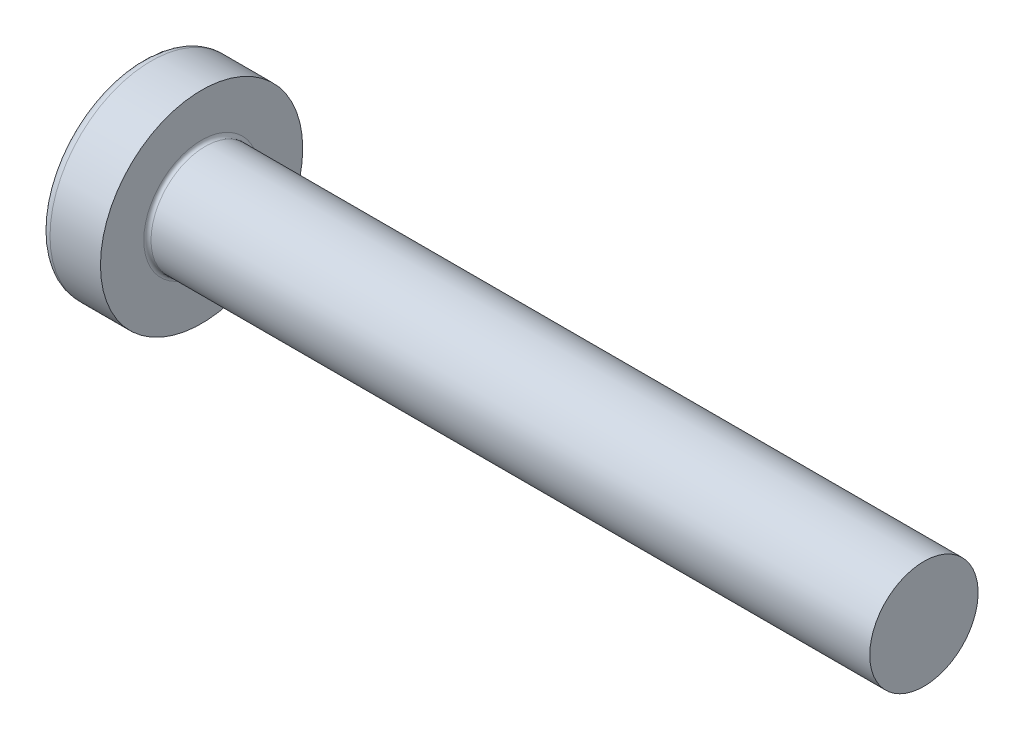
ISO-10303-21;
HEADER;
FILE_DESCRIPTION(('STEP AP214'),'2;1');
FILE_NAME('part.step','',(''),(''),'','','');
FILE_SCHEMA(('AUTOMOTIVE_DESIGN { 1 0 10303 214 1 1 1 1 }'));
ENDSEC;
DATA;
#1=APPLICATION_CONTEXT('core data for automotive mechanical design processes');
#2=APPLICATION_PROTOCOL_DEFINITION('international standard','automotive_design',2000,#1);
#3=PRODUCT_CONTEXT('',#1,'mechanical');
#4=PRODUCT('Part','Part','',(#3));
#5=PRODUCT_RELATED_PRODUCT_CATEGORY('part','',(#4));
#6=PRODUCT_DEFINITION_FORMATION('','',#4);
#7=PRODUCT_DEFINITION_CONTEXT('part definition',#1,'design');
#8=PRODUCT_DEFINITION('design','',#6,#7);
#9=PRODUCT_DEFINITION_SHAPE('','',#8);
#10=(LENGTH_UNIT() NAMED_UNIT(*) SI_UNIT(.MILLI.,.METRE.));
#11=(NAMED_UNIT(*) PLANE_ANGLE_UNIT() SI_UNIT($,.RADIAN.));
#12=(NAMED_UNIT(*) SI_UNIT($,.STERADIAN.) SOLID_ANGLE_UNIT());
#13=UNCERTAINTY_MEASURE_WITH_UNIT(LENGTH_MEASURE(1.E-05),#10,'distance_accuracy_value','');
#14=(GEOMETRIC_REPRESENTATION_CONTEXT(3) GLOBAL_UNCERTAINTY_ASSIGNED_CONTEXT((#13)) GLOBAL_UNIT_ASSIGNED_CONTEXT((#10,
#11,#12)) REPRESENTATION_CONTEXT('',''));
#15=CARTESIAN_POINT('',(0.,0.,0.));
#16=DIRECTION('',(0.,0.,1.));
#17=DIRECTION('',(1.,0.,0.));
#18=AXIS2_PLACEMENT_3D('',#15,#16,#17);
#19=CARTESIAN_POINT('',(5.,0.,0.));
#20=DIRECTION('',(-1.,0.,0.));
#21=DIRECTION('',(0.,1.,0.));
#22=AXIS2_PLACEMENT_3D('',#19,#20,#21);
#23=SPHERICAL_SURFACE('',#22,5.);
#24=CARTESIAN_POINT('',(0.775371598933736,0.,0.));
#25=DIRECTION('',(-1.,0.,0.));
#26=DIRECTION('',(0.,0.,1.));
#27=AXIS2_PLACEMENT_3D('',#24,#25,#26);
#28=CIRCLE('',#27,2.67441860465116);
#29=CARTESIAN_POINT('',(0.775371598933736,0.,2.67441860465116));
#30=VERTEX_POINT('',#29);
#31=EDGE_CURVE('E238',#30,#30,#28,.T.);
#32=ORIENTED_EDGE('',*,*,#31,.T.);
#33=EDGE_LOOP('',(#32));
#34=FACE_BOUND('',#33,.T.);
#35=CARTESIAN_POINT('',(0.0457951200896452,0.,0.));
#36=DIRECTION('',(1.,0.,0.));
#37=DIRECTION('',(0.,0.,-1.));
#38=AXIS2_PLACEMENT_3D('',#35,#36,#37);
#39=CIRCLE('',#38,0.675169614150692);
#40=CARTESIAN_POINT('',(0.0457951200896426,-0.369999999999998,-0.564760133040919));
#41=VERTEX_POINT('',#40);
#42=CARTESIAN_POINT('',(0.0457951200896452,-0.564760133040931,-0.37));
#43=VERTEX_POINT('',#42);
#44=EDGE_CURVE('E374',#41,#43,#39,.F.);
#45=ORIENTED_EDGE('',*,*,#44,.F.);
#46=CARTESIAN_POINT('',(5.,-0.37,0.));
#47=DIRECTION('',(0.,1.,0.));
#48=DIRECTION('',(0.,0.,1.));
#49=AXIS2_PLACEMENT_3D('',#46,#47,#48);
#50=CIRCLE('',#49,4.98629120689917);
#51=CARTESIAN_POINT('',(0.18786973422864,-0.369999999999995,-1.30633162146802));
#52=VERTEX_POINT('',#51);
#53=EDGE_CURVE('E300',#52,#41,#50,.T.);
#54=ORIENTED_EDGE('',*,*,#53,.F.);
#55=CARTESIAN_POINT('',(4.56358262530798,0.,0.875317983305918));
#56=DIRECTION('',(0.446197753347436,0.,-0.894934391398443));
#57=DIRECTION('',(-0.894934391398443,0.,-0.446197753347436));
#58=AXIS2_PLACEMENT_3D('',#55,#56,#57);
#59=CIRCLE('',#58,4.90340272700175);
#60=CARTESIAN_POINT('',(0.187869734228642,0.370000000000005,-1.30633162146801));
#61=VERTEX_POINT('',#60);
#62=EDGE_CURVE('E272',#52,#61,#59,.T.);
#63=ORIENTED_EDGE('',*,*,#62,.T.);
#64=CARTESIAN_POINT('',(5.,0.37,0.));
#65=DIRECTION('',(0.,-1.,0.));
#66=DIRECTION('',(0.,0.,-1.));
#67=AXIS2_PLACEMENT_3D('',#64,#65,#66);
#68=CIRCLE('',#67,4.98629120689917);
#69=CARTESIAN_POINT('',(0.0457951200896447,0.370000000000002,-0.564760133040916));
#70=VERTEX_POINT('',#69);
#71=EDGE_CURVE('E327',#70,#61,#68,.T.);
#72=ORIENTED_EDGE('',*,*,#71,.F.);
#73=CARTESIAN_POINT('',(0.0457951200896452,0.564760133040921,-0.37));
#74=VERTEX_POINT('',#73);
#75=EDGE_CURVE('E393',#74,#70,#39,.F.);
#76=ORIENTED_EDGE('',*,*,#75,.F.);
#77=CARTESIAN_POINT('',(5.,0.,-0.37));
#78=DIRECTION('',(0.,0.,1.));
#79=DIRECTION('',(1.,0.,0.));
#80=AXIS2_PLACEMENT_3D('',#77,#78,#79);
#81=CIRCLE('',#80,4.98629120689917);
#82=CARTESIAN_POINT('',(0.187869734228643,1.30633162146802,-0.37));
#83=VERTEX_POINT('',#82);
#84=EDGE_CURVE('E266',#83,#74,#81,.T.);
#85=ORIENTED_EDGE('',*,*,#84,.F.);
#86=CARTESIAN_POINT('',(4.56358262530798,-0.875317983305921,0.));
#87=DIRECTION('',(0.446197753347436,0.894934391398442,0.));
#88=DIRECTION('',(-0.894934391398442,0.446197753347436,0.));
#89=AXIS2_PLACEMENT_3D('',#86,#87,#88);
#90=CIRCLE('',#89,4.90340272700175);
#91=CARTESIAN_POINT('',(0.187869734228642,1.30633162146802,0.37));
#92=VERTEX_POINT('',#91);
#93=EDGE_CURVE('E269',#83,#92,#90,.T.);
#94=ORIENTED_EDGE('',*,*,#93,.T.);
#95=CARTESIAN_POINT('',(5.,0.,0.37));
#96=DIRECTION('',(0.,0.,-1.));
#97=DIRECTION('',(0.,1.,0.));
#98=AXIS2_PLACEMENT_3D('',#95,#96,#97);
#99=CIRCLE('',#98,4.98629120689917);
#100=CARTESIAN_POINT('',(0.0457951200896452,0.564760133040921,0.37));
#101=VERTEX_POINT('',#100);
#102=EDGE_CURVE('E262',#101,#92,#99,.T.);
#103=ORIENTED_EDGE('',*,*,#102,.F.);
#104=CARTESIAN_POINT('',(0.0457951200896452,0.369999999999998,0.564760133040918));
#105=VERTEX_POINT('',#104);
#106=EDGE_CURVE('E392',#105,#101,#39,.F.);
#107=ORIENTED_EDGE('',*,*,#106,.F.);
#108=CARTESIAN_POINT('',(0.187869734228642,0.369999999999995,1.30633162146802));
#109=VERTEX_POINT('',#108);
#110=EDGE_CURVE('E282',#109,#105,#68,.T.);
#111=ORIENTED_EDGE('',*,*,#110,.F.);
#112=CARTESIAN_POINT('',(4.56358262530798,0.,-0.87531798330592));
#113=DIRECTION('',(0.446197753347436,0.,0.894934391398442));
#114=DIRECTION('',(0.894934391398442,0.,-0.446197753347436));
#115=AXIS2_PLACEMENT_3D('',#112,#113,#114);
#116=CIRCLE('',#115,4.90340272700175);
#117=CARTESIAN_POINT('',(0.18786973422864,-0.370000000000004,1.30633162146802));
#118=VERTEX_POINT('',#117);
#119=EDGE_CURVE('E49',#109,#118,#116,.T.);
#120=ORIENTED_EDGE('',*,*,#119,.T.);
#121=CARTESIAN_POINT('',(0.0457951200896416,-0.370000000000002,0.564760133040916));
#122=VERTEX_POINT('',#121);
#123=EDGE_CURVE('E279',#122,#118,#50,.T.);
#124=ORIENTED_EDGE('',*,*,#123,.F.);
#125=CARTESIAN_POINT('',(0.0457951200896452,-0.564760133040931,0.37));
#126=VERTEX_POINT('',#125);
#127=EDGE_CURVE('E432',#126,#122,#39,.F.);
#128=ORIENTED_EDGE('',*,*,#127,.F.);
#129=CARTESIAN_POINT('',(0.187869734228639,-1.30633162146802,0.37));
#130=VERTEX_POINT('',#129);
#131=EDGE_CURVE('E263',#130,#126,#99,.T.);
#132=ORIENTED_EDGE('',*,*,#131,.F.);
#133=CARTESIAN_POINT('',(4.56358262530798,0.875317983305917,0.));
#134=DIRECTION('',(0.446197753347436,-0.894934391398443,0.));
#135=DIRECTION('',(0.894934391398443,0.446197753347436,0.));
#136=AXIS2_PLACEMENT_3D('',#133,#134,#135);
#137=CIRCLE('',#136,4.90340272700175);
#138=CARTESIAN_POINT('',(0.187869734228639,-1.30633162146802,-0.37));
#139=VERTEX_POINT('',#138);
#140=EDGE_CURVE('E259',#130,#139,#137,.T.);
#141=ORIENTED_EDGE('',*,*,#140,.T.);
#142=EDGE_CURVE('E64',#43,#139,#81,.T.);
#143=ORIENTED_EDGE('',*,*,#142,.F.);
#144=EDGE_LOOP('',(#45,#54,#63,#72,#76,#85,#94,#103,#107,#111,#120,#124,#128,#132,#141,#143));
#145=FACE_BOUND('',#144,.T.);
#146=ADVANCED_FACE('F35',(#34,#145),#23,.T.);
#147=CARTESIAN_POINT('',(1.75,0.527482331818931,-0.37));
#148=DIRECTION('',(0.,0.,1.));
#149=DIRECTION('',(1.,0.,0.));
#150=AXIS2_PLACEMENT_3D('',#147,#148,#149);
#151=PLANE('',#150);
#152=ORIENTED_EDGE('',*,*,#84,.T.);
#153=CARTESIAN_POINT('',(-0.987293237053714,0.649401255967161,-0.37));
#154=CARTESIAN_POINT('',(-0.781914975317082,0.632865887002871,-0.37));
#155=CARTESIAN_POINT('',(-0.57654788239337,0.616188977635081,-0.37));
#156=CARTESIAN_POINT('',(-0.165841599226325,0.582441031964227,-0.37));
#157=CARTESIAN_POINT('',(0.0394975903090468,0.565369987054879,-0.37));
#158=CARTESIAN_POINT('',(0.450133475422574,0.530723441326535,-0.37));
#159=CARTESIAN_POINT('',(0.655430171010575,0.513147940624557,-0.37));
#160=CARTESIAN_POINT('',(1.06596140177934,0.477314957985794,-0.37));
#161=CARTESIAN_POINT('',(1.27119593780711,0.459057485806066,-0.37));
#162=CARTESIAN_POINT('',(1.61065292365626,0.428051938688768,-0.37));
#163=CARTESIAN_POINT('',(1.74490059995643,0.415580824990931,-0.37));
#164=CARTESIAN_POINT('',(2.01334321762763,0.390092023404979,-0.37));
#165=CARTESIAN_POINT('',(2.14753815934577,0.377074339177353,-0.37));
#166=CARTESIAN_POINT('',(2.41586354151957,0.350315629452842,-0.37));
#167=CARTESIAN_POINT('',(2.5499939784531,0.33657456817765,-0.37));
#168=CARTESIAN_POINT('',(2.81814173295471,0.308004077741875,-0.37));
#169=CARTESIAN_POINT('',(2.95215904765134,0.293174621747065,-0.37));
#170=CARTESIAN_POINT('',(3.0860955068368,0.277618485071816,-0.37));
#171=B_SPLINE_CURVE_WITH_KNOTS('',3,(#153,#154,#155,#156,#157,#158,#159,#160,#161,#162,#163,
#164,#165,#166,#167,#168,#169,#170),.UNSPECIFIED.,.F.,.F.,(4,2,2,2,2,2,2,2,4),(0.,
0.618128793984691,1.23627109812525,1.85441325887562,2.4725465791681,2.87702276218609,
3.28149623678161,3.68598973550942,4.09049321032311),.UNSPECIFIED.);
#172=CARTESIAN_POINT('',(1.75,0.415013252800437,-0.37));
#173=VERTEX_POINT('',#172);
#174=EDGE_CURVE('E416',#74,#173,#171,.T.);
#175=ORIENTED_EDGE('',*,*,#174,.T.);
#176=DIRECTION('',(0.,1.,0.));
#177=VECTOR('',#176,1.);
#178=CARTESIAN_POINT('',(1.75,-0.527482331818931,-0.37));
#179=LINE('',#178,#177);
#180=CARTESIAN_POINT('',(1.75,0.527482331818931,-0.37));
#181=VERTEX_POINT('',#180);
#182=EDGE_CURVE('E356',#173,#181,#179,.T.);
#183=ORIENTED_EDGE('',*,*,#182,.T.);
#184=DIRECTION('',(0.894934391398442,-0.446197753347436,0.));
#185=VECTOR('',#184,1.);
#186=CARTESIAN_POINT('',(0.,1.4,-0.37));
#187=LINE('',#186,#185);
#188=EDGE_CURVE('E239',#83,#181,#187,.T.);
#189=ORIENTED_EDGE('',*,*,#188,.F.);
#190=EDGE_LOOP('',(#152,#175,#183,#189));
#191=FACE_BOUND('',#190,.T.);
#192=ADVANCED_FACE('F194',(#191),#151,.T.);
#193=CARTESIAN_POINT('',(1.75,-0.527482331818931,-0.37));
#194=VERTEX_POINT('',#193);
#195=CARTESIAN_POINT('',(1.75,-0.415013252800437,-0.37));
#196=VERTEX_POINT('',#195);
#197=EDGE_CURVE('E247',#194,#196,#179,.T.);
#198=ORIENTED_EDGE('',*,*,#197,.T.);
#199=CARTESIAN_POINT('',(-0.987293237053716,-0.649401255967161,-0.37));
#200=CARTESIAN_POINT('',(-0.781914975317084,-0.632865887002871,-0.37));
#201=CARTESIAN_POINT('',(-0.576547882393373,-0.616188977635081,-0.37));
#202=CARTESIAN_POINT('',(-0.165841599226327,-0.582441031964227,-0.37));
#203=CARTESIAN_POINT('',(0.0394975903090452,-0.565369987054879,-0.37));
#204=CARTESIAN_POINT('',(0.450133475422572,-0.530723441326535,-0.37));
#205=CARTESIAN_POINT('',(0.655430171010574,-0.513147940624557,-0.37));
#206=CARTESIAN_POINT('',(1.06596140177934,-0.477314957985794,-0.37));
#207=CARTESIAN_POINT('',(1.2711959378071,-0.459057485806066,-0.37));
#208=CARTESIAN_POINT('',(1.61065292365626,-0.428051938688768,-0.37));
#209=CARTESIAN_POINT('',(1.74490059995643,-0.415580824990931,-0.37));
#210=CARTESIAN_POINT('',(2.01334321762763,-0.390092023404979,-0.37));
#211=CARTESIAN_POINT('',(2.14753815934577,-0.377074339177353,-0.37));
#212=CARTESIAN_POINT('',(2.41586354151957,-0.350315629452842,-0.37));
#213=CARTESIAN_POINT('',(2.5499939784531,-0.33657456817765,-0.37));
#214=CARTESIAN_POINT('',(2.81814173295471,-0.308004077741875,-0.37));
#215=CARTESIAN_POINT('',(2.95215904765134,-0.293174621747065,-0.37));
#216=CARTESIAN_POINT('',(3.0860955068368,-0.277618485071816,-0.37));
#217=B_SPLINE_CURVE_WITH_KNOTS('',3,(#199,#200,#201,#202,#203,#204,#205,#206,#207,#208,#209,
#210,#211,#212,#213,#214,#215,#216),.UNSPECIFIED.,.F.,.F.,(4,2,2,2,2,2,2,2,4),(0.,
0.618128793984691,1.23627109812525,1.85441325887562,2.4725465791681,2.87702276218609,
3.28149623678161,3.68598973550942,4.09049321032311),.UNSPECIFIED.);
#218=EDGE_CURVE('E391',#196,#43,#217,.F.);
#219=ORIENTED_EDGE('',*,*,#218,.T.);
#220=ORIENTED_EDGE('',*,*,#142,.T.);
#221=DIRECTION('',(0.894934391398443,0.446197753347436,0.));
#222=VECTOR('',#221,1.);
#223=CARTESIAN_POINT('',(0.,-1.4,-0.37));
#224=LINE('',#223,#222);
#225=EDGE_CURVE('E330',#139,#194,#224,.T.);
#226=ORIENTED_EDGE('',*,*,#225,.T.);
#227=EDGE_LOOP('',(#198,#219,#220,#226));
#228=FACE_BOUND('',#227,.T.);
#229=ADVANCED_FACE('F200',(#228),#151,.T.);
#230=CARTESIAN_POINT('',(1.75,-0.527482331818932,0.37));
#231=DIRECTION('',(0.,0.,-1.));
#232=DIRECTION('',(0.,1.,0.));
#233=AXIS2_PLACEMENT_3D('',#230,#231,#232);
#234=PLANE('',#233);
#235=DIRECTION('',(0.,-1.,0.));
#236=VECTOR('',#235,1.);
#237=CARTESIAN_POINT('',(1.75,0.527482331818931,0.37));
#238=LINE('',#237,#236);
#239=CARTESIAN_POINT('',(1.75,0.527482331818931,0.37));
#240=VERTEX_POINT('',#239);
#241=CARTESIAN_POINT('',(1.75,0.415013252800437,0.37));
#242=VERTEX_POINT('',#241);
#243=EDGE_CURVE('E339',#240,#242,#238,.T.);
#244=ORIENTED_EDGE('',*,*,#243,.T.);
#245=CARTESIAN_POINT('',(-0.987293237069634,0.649401255968442,0.37));
#246=CARTESIAN_POINT('',(-0.7819149753313,0.632865887004023,0.37));
#247=CARTESIAN_POINT('',(-0.576547882405887,0.616188977636103,0.37));
#248=CARTESIAN_POINT('',(-0.165841599235439,0.582441031964983,0.37));
#249=CARTESIAN_POINT('',(0.0394975903016343,0.5653699870555,0.37));
#250=CARTESIAN_POINT('',(0.450133475420602,0.530723441326706,0.37));
#251=CARTESIAN_POINT('',(0.655430171012341,0.513147940624409,0.37));
#252=CARTESIAN_POINT('',(1.06596140178858,0.477314957984981,0.37));
#253=CARTESIAN_POINT('',(1.27119593782008,0.459057485804908,0.37));
#254=CARTESIAN_POINT('',(1.61065292367297,0.428051938687225,0.37));
#255=CARTESIAN_POINT('',(1.74490059997313,0.415580824989367,0.37));
#256=CARTESIAN_POINT('',(2.01334321764434,0.390092023403371,0.37));
#257=CARTESIAN_POINT('',(2.14753815936247,0.377074339175718,0.37));
#258=CARTESIAN_POINT('',(2.41586354153627,0.350315629451146,0.37));
#259=CARTESIAN_POINT('',(2.54999397846979,0.336574568175918,0.37));
#260=CARTESIAN_POINT('',(2.8181417329714,0.308004077740054,0.37));
#261=CARTESIAN_POINT('',(2.95215904766802,0.293174621745189,0.37));
#262=CARTESIAN_POINT('',(3.08609550685347,0.277618485069873,0.37));
#263=B_SPLINE_CURVE_WITH_KNOTS('',3,(#245,#246,#247,#248,#249,#250,#251,#252,#253,#254,#255,
#256,#257,#258,#259,#260,#261,#262),.UNSPECIFIED.,.F.,.F.,(4,2,2,2,2,2,2,2,4),(0.,
0.61812879398981,1.23627109813549,1.85441325889711,2.47254657920086,2.87702276221884,
3.28149623681436,3.68598973554217,4.09049321035586),.UNSPECIFIED.);
#264=EDGE_CURVE('E671',#242,#101,#263,.F.);
#265=ORIENTED_EDGE('',*,*,#264,.T.);
#266=ORIENTED_EDGE('',*,*,#102,.T.);
#267=DIRECTION('',(0.894934391398442,-0.446197753347436,0.));
#268=VECTOR('',#267,1.);
#269=CARTESIAN_POINT('',(0.,1.4,0.37));
#270=LINE('',#269,#268);
#271=EDGE_CURVE('E244',#92,#240,#270,.T.);
#272=ORIENTED_EDGE('',*,*,#271,.T.);
#273=EDGE_LOOP('',(#244,#265,#266,#272));
#274=FACE_BOUND('',#273,.T.);
#275=ADVANCED_FACE('F412',(#274),#234,.T.);
#276=ORIENTED_EDGE('',*,*,#131,.T.);
#277=CARTESIAN_POINT('',(-0.987293237069634,-0.649401255968442,0.37));
#278=CARTESIAN_POINT('',(-0.7819149753313,-0.632865887004024,0.37));
#279=CARTESIAN_POINT('',(-0.576547882405887,-0.616188977636103,0.37));
#280=CARTESIAN_POINT('',(-0.165841599235439,-0.582441031964983,0.37));
#281=CARTESIAN_POINT('',(0.0394975903016343,-0.5653699870555,0.37));
#282=CARTESIAN_POINT('',(0.450133475420602,-0.530723441326706,0.37));
#283=CARTESIAN_POINT('',(0.655430171012341,-0.513147940624409,0.37));
#284=CARTESIAN_POINT('',(1.06596140178858,-0.477314957984981,0.37));
#285=CARTESIAN_POINT('',(1.27119593782008,-0.459057485804908,0.37));
#286=CARTESIAN_POINT('',(1.61065292367297,-0.428051938687225,0.37));
#287=CARTESIAN_POINT('',(1.74490059997313,-0.415580824989367,0.37));
#288=CARTESIAN_POINT('',(2.01334321764434,-0.390092023403371,0.37));
#289=CARTESIAN_POINT('',(2.14753815936247,-0.377074339175718,0.37));
#290=CARTESIAN_POINT('',(2.41586354153627,-0.350315629451146,0.37));
#291=CARTESIAN_POINT('',(2.54999397846979,-0.336574568175918,0.37));
#292=CARTESIAN_POINT('',(2.8181417329714,-0.308004077740054,0.37));
#293=CARTESIAN_POINT('',(2.95215904766802,-0.29317462174519,0.37));
#294=CARTESIAN_POINT('',(3.08609550685347,-0.277618485069873,0.37));
#295=B_SPLINE_CURVE_WITH_KNOTS('',3,(#277,#278,#279,#280,#281,#282,#283,#284,#285,#286,#287,
#288,#289,#290,#291,#292,#293,#294),.UNSPECIFIED.,.F.,.F.,(4,2,2,2,2,2,2,2,4),(0.,
0.61812879398981,1.23627109813549,1.85441325889711,2.47254657920086,2.87702276221884,
3.28149623681436,3.68598973554217,4.09049321035586),.UNSPECIFIED.);
#296=CARTESIAN_POINT('',(1.75,-0.415013252800437,0.37));
#297=VERTEX_POINT('',#296);
#298=EDGE_CURVE('E433',#126,#297,#295,.T.);
#299=ORIENTED_EDGE('',*,*,#298,.T.);
#300=CARTESIAN_POINT('',(1.75,-0.527482331818932,0.37));
#301=VERTEX_POINT('',#300);
#302=EDGE_CURVE('E341',#297,#301,#238,.T.);
#303=ORIENTED_EDGE('',*,*,#302,.T.);
#304=DIRECTION('',(0.894934391398443,0.446197753347436,0.));
#305=VECTOR('',#304,1.);
#306=CARTESIAN_POINT('',(0.,-1.4,0.37));
#307=LINE('',#306,#305);
#308=EDGE_CURVE('E332',#130,#301,#307,.T.);
#309=ORIENTED_EDGE('',*,*,#308,.F.);
#310=EDGE_LOOP('',(#276,#299,#303,#309));
#311=FACE_BOUND('',#310,.T.);
#312=ADVANCED_FACE('F519',(#311),#234,.T.);
#313=CARTESIAN_POINT('',(1.75,0.527482331818931,0.37));
#314=DIRECTION('',(0.446197753347436,0.894934391398442,0.));
#315=DIRECTION('',(-0.894934391398442,0.446197753347436,0.));
#316=AXIS2_PLACEMENT_3D('',#313,#314,#315);
#317=PLANE('',#316);
#318=CARTESIAN_POINT('',(2.6696526882832,0.0689604923233258,0.));
#319=DIRECTION('',(0.446197753347436,0.894934391398442,0.));
#320=DIRECTION('',(-0.894934391398442,0.446197753347436,0.));
#321=AXIS2_PLACEMENT_3D('',#318,#319,#320);
#322=ELLIPSE('',#321,1.10195897609153,0.486831694838766);
#323=CARTESIAN_POINT('',(1.75,0.527482331818932,0.175779377683682));
#324=VERTEX_POINT('',#323);
#325=CARTESIAN_POINT('',(1.75,0.527482331818932,-0.175779377683682));
#326=VERTEX_POINT('',#325);
#327=EDGE_CURVE('E305',#324,#326,#322,.F.);
#328=ORIENTED_EDGE('',*,*,#327,.F.);
#329=DIRECTION('',(0.,0.,-1.));
#330=VECTOR('',#329,1.);
#331=CARTESIAN_POINT('',(1.75,0.527482331818931,0.37));
#332=LINE('',#331,#330);
#333=EDGE_CURVE('E342',#240,#324,#332,.T.);
#334=ORIENTED_EDGE('',*,*,#333,.F.);
#335=ORIENTED_EDGE('',*,*,#271,.F.);
#336=ORIENTED_EDGE('',*,*,#93,.F.);
#337=ORIENTED_EDGE('',*,*,#188,.T.);
#338=EDGE_CURVE('E344',#326,#181,#332,.T.);
#339=ORIENTED_EDGE('',*,*,#338,.F.);
#340=EDGE_LOOP('',(#328,#334,#335,#336,#337,#339));
#341=FACE_BOUND('',#340,.T.);
#342=ADVANCED_FACE('F410',(#341),#317,.F.);
#343=CARTESIAN_POINT('',(0.,-1.4,-0.37));
#344=DIRECTION('',(0.446197753347436,-0.894934391398443,0.));
#345=DIRECTION('',(0.894934391398443,0.446197753347436,0.));
#346=AXIS2_PLACEMENT_3D('',#343,#344,#345);
#347=PLANE('',#346);
#348=CARTESIAN_POINT('',(2.6696526882832,-0.0689604923233255,0.));
#349=DIRECTION('',(0.446197753347436,-0.894934391398443,0.));
#350=DIRECTION('',(-0.894934391398443,-0.446197753347436,0.));
#351=AXIS2_PLACEMENT_3D('',#348,#349,#350);
#352=ELLIPSE('',#351,1.10195897609154,0.486831694838766);
#353=CARTESIAN_POINT('',(1.75,-0.527482331818932,-0.175779377683681));
#354=VERTEX_POINT('',#353);
#355=CARTESIAN_POINT('',(1.75,-0.527482331818932,0.17577937768368));
#356=VERTEX_POINT('',#355);
#357=EDGE_CURVE('E673',#354,#356,#352,.F.);
#358=ORIENTED_EDGE('',*,*,#357,.F.);
#359=DIRECTION('',(0.,0.,1.));
#360=VECTOR('',#359,1.);
#361=CARTESIAN_POINT('',(1.75,-0.527482331818931,-0.37));
#362=LINE('',#361,#360);
#363=EDGE_CURVE('E335',#194,#354,#362,.T.);
#364=ORIENTED_EDGE('',*,*,#363,.F.);
#365=ORIENTED_EDGE('',*,*,#225,.F.);
#366=ORIENTED_EDGE('',*,*,#140,.F.);
#367=ORIENTED_EDGE('',*,*,#308,.T.);
#368=EDGE_CURVE('E338',#356,#301,#362,.T.);
#369=ORIENTED_EDGE('',*,*,#368,.F.);
#370=EDGE_LOOP('',(#358,#364,#365,#366,#367,#369));
#371=FACE_BOUND('',#370,.T.);
#372=ADVANCED_FACE('F506',(#371),#347,.F.);
#373=CARTESIAN_POINT('',(1.75,0.527482331818931,-0.37));
#374=DIRECTION('',(-1.,0.,0.));
#375=DIRECTION('',(0.,0.,1.));
#376=AXIS2_PLACEMENT_3D('',#373,#374,#375);
#377=PLANE('',#376);
#378=DIRECTION('',(0.,1.,0.));
#379=VECTOR('',#378,1.);
#380=CARTESIAN_POINT('',(1.75,-0.370000000000002,0.52748233181893));
#381=LINE('',#380,#379);
#382=CARTESIAN_POINT('',(1.75,-0.370000000000002,0.52748233181893));
#383=VERTEX_POINT('',#382);
#384=CARTESIAN_POINT('',(1.75,-0.175779377683686,0.52748233181893));
#385=VERTEX_POINT('',#384);
#386=EDGE_CURVE('E320',#383,#385,#381,.T.);
#387=ORIENTED_EDGE('',*,*,#386,.T.);
#388=CARTESIAN_POINT('',(1.75,0.,0.));
#389=DIRECTION('',(-1.,0.,0.));
#390=DIRECTION('',(0.,0.,1.));
#391=AXIS2_PLACEMENT_3D('',#388,#389,#390);
#392=CIRCLE('',#391,0.556);
#393=CARTESIAN_POINT('',(1.75,-0.370000000000001,0.415013252800437));
#394=VERTEX_POINT('',#393);
#395=EDGE_CURVE('E701',#394,#385,#392,.T.);
#396=ORIENTED_EDGE('',*,*,#395,.F.);
#397=DIRECTION('',(0.,0.,-1.));
#398=VECTOR('',#397,1.);
#399=CARTESIAN_POINT('',(1.75,-0.370000000000002,0.52748233181893));
#400=LINE('',#399,#398);
#401=EDGE_CURVE('E316',#383,#394,#400,.T.);
#402=ORIENTED_EDGE('',*,*,#401,.F.);
#403=EDGE_LOOP('',(#387,#396,#402));
#404=FACE_BOUND('',#403,.T.);
#405=ADVANCED_FACE('F499',(#404),#377,.T.);
#406=ORIENTED_EDGE('',*,*,#302,.F.);
#407=EDGE_CURVE('E706',#356,#297,#392,.T.);
#408=ORIENTED_EDGE('',*,*,#407,.F.);
#409=ORIENTED_EDGE('',*,*,#368,.T.);
#410=EDGE_LOOP('',(#406,#408,#409));
#411=FACE_BOUND('',#410,.T.);
#412=ADVANCED_FACE('F492',(#411),#377,.T.);
#413=ORIENTED_EDGE('',*,*,#363,.T.);
#414=EDGE_CURVE('E385',#196,#354,#392,.T.);
#415=ORIENTED_EDGE('',*,*,#414,.F.);
#416=ORIENTED_EDGE('',*,*,#197,.F.);
#417=EDGE_LOOP('',(#413,#415,#416));
#418=FACE_BOUND('',#417,.T.);
#419=ADVANCED_FACE('F486',(#418),#377,.T.);
#420=CARTESIAN_POINT('',(1.75,-0.369999999999998,-0.415013252800438));
#421=VERTEX_POINT('',#420);
#422=CARTESIAN_POINT('',(1.75,-0.369999999999998,-0.527482331818933));
#423=VERTEX_POINT('',#422);
#424=EDGE_CURVE('E319',#421,#423,#400,.T.);
#425=ORIENTED_EDGE('',*,*,#424,.F.);
#426=CARTESIAN_POINT('',(1.75,-0.17577937768368,-0.527482331818932));
#427=VERTEX_POINT('',#426);
#428=EDGE_CURVE('E56',#427,#421,#392,.T.);
#429=ORIENTED_EDGE('',*,*,#428,.F.);
#430=DIRECTION('',(0.,-1.,0.));
#431=VECTOR('',#430,1.);
#432=CARTESIAN_POINT('',(1.75,0.370000000000002,-0.52748233181893));
#433=LINE('',#432,#431);
#434=EDGE_CURVE('E315',#427,#423,#433,.T.);
#435=ORIENTED_EDGE('',*,*,#434,.T.);
#436=EDGE_LOOP('',(#425,#429,#435));
#437=FACE_BOUND('',#436,.T.);
#438=ADVANCED_FACE('F380',(#437),#377,.T.);
#439=CARTESIAN_POINT('',(1.75,0.370000000000002,-0.52748233181893));
#440=VERTEX_POINT('',#439);
#441=CARTESIAN_POINT('',(1.75,0.175779377683684,-0.527482331818931));
#442=VERTEX_POINT('',#441);
#443=EDGE_CURVE('E312',#440,#442,#433,.T.);
#444=ORIENTED_EDGE('',*,*,#443,.T.);
#445=CARTESIAN_POINT('',(1.75,0.370000000000001,-0.415013252800436));
#446=VERTEX_POINT('',#445);
#447=EDGE_CURVE('E384',#446,#442,#392,.T.);
#448=ORIENTED_EDGE('',*,*,#447,.F.);
#449=DIRECTION('',(0.,0.,1.));
#450=VECTOR('',#449,1.);
#451=CARTESIAN_POINT('',(1.75,0.370000000000002,-0.52748233181893));
#452=LINE('',#451,#450);
#453=EDGE_CURVE('E324',#440,#446,#452,.T.);
#454=ORIENTED_EDGE('',*,*,#453,.F.);
#455=EDGE_LOOP('',(#444,#448,#454));
#456=FACE_BOUND('',#455,.T.);
#457=ADVANCED_FACE('F474',(#456),#377,.T.);
#458=ORIENTED_EDGE('',*,*,#182,.F.);
#459=EDGE_CURVE('E690',#326,#173,#392,.T.);
#460=ORIENTED_EDGE('',*,*,#459,.F.);
#461=ORIENTED_EDGE('',*,*,#338,.T.);
#462=EDGE_LOOP('',(#458,#460,#461));
#463=FACE_BOUND('',#462,.T.);
#464=ADVANCED_FACE('F467',(#463),#377,.T.);
#465=ORIENTED_EDGE('',*,*,#333,.T.);
#466=EDGE_CURVE('E692',#242,#324,#392,.T.);
#467=ORIENTED_EDGE('',*,*,#466,.F.);
#468=ORIENTED_EDGE('',*,*,#243,.F.);
#469=EDGE_LOOP('',(#465,#467,#468));
#470=FACE_BOUND('',#469,.T.);
#471=ADVANCED_FACE('F461',(#470),#377,.T.);
#472=CARTESIAN_POINT('',(1.75,0.369999999999998,0.527482331818932));
#473=DIRECTION('',(0.,-1.,0.));
#474=DIRECTION('',(1.,0.,0.));
#475=AXIS2_PLACEMENT_3D('',#472,#473,#474);
#476=PLANE('',#475);
#477=ORIENTED_EDGE('',*,*,#110,.T.);
#478=CARTESIAN_POINT('',(-0.987293237069634,0.369999999999998,0.649401255968443));
#479=CARTESIAN_POINT('',(-0.7819149753313,0.369999999999998,0.632865887004024));
#480=CARTESIAN_POINT('',(-0.576547882405887,0.369999999999998,0.616188977636104));
#481=CARTESIAN_POINT('',(-0.165841599235439,0.369999999999998,0.582441031964984));
#482=CARTESIAN_POINT('',(0.0394975903016347,0.369999999999998,0.565369987055501));
#483=CARTESIAN_POINT('',(0.450133475420603,0.369999999999998,0.530723441326707));
#484=CARTESIAN_POINT('',(0.655430171012342,0.369999999999998,0.51314794062441));
#485=CARTESIAN_POINT('',(1.06596140178858,0.369999999999998,0.477314957984982));
#486=CARTESIAN_POINT('',(1.27119593782008,0.369999999999998,0.459057485804909));
#487=CARTESIAN_POINT('',(1.61065292367297,0.369999999999999,0.428051938687226));
#488=CARTESIAN_POINT('',(1.74490059997313,0.369999999999999,0.415580824989369));
#489=CARTESIAN_POINT('',(2.01334321764434,0.369999999999999,0.390092023403372));
#490=CARTESIAN_POINT('',(2.14753815936247,0.369999999999999,0.377074339175719));
#491=CARTESIAN_POINT('',(2.41586354153627,0.369999999999999,0.350315629451147));
#492=CARTESIAN_POINT('',(2.54999397846979,0.369999999999999,0.336574568175919));
#493=CARTESIAN_POINT('',(2.8181417329714,0.369999999999999,0.308004077740055));
#494=CARTESIAN_POINT('',(2.95215904766802,0.369999999999999,0.293174621745191));
#495=CARTESIAN_POINT('',(3.08609550685347,0.369999999999999,0.277618485069874));
#496=B_SPLINE_CURVE_WITH_KNOTS('',3,(#478,#479,#480,#481,#482,#483,#484,#485,#486,#487,#488,
#489,#490,#491,#492,#493,#494,#495),.UNSPECIFIED.,.F.,.F.,(4,2,2,2,2,2,2,2,4),(0.,
0.61812879398981,1.2362710981355,1.85441325889711,2.47254657920086,2.87702276221884,
3.28149623681436,3.68598973554217,4.09049321035586),.UNSPECIFIED.);
#497=CARTESIAN_POINT('',(1.75,0.369999999999999,0.415013252800439));
#498=VERTEX_POINT('',#497);
#499=EDGE_CURVE('E670',#105,#498,#496,.T.);
#500=ORIENTED_EDGE('',*,*,#499,.T.);
#501=CARTESIAN_POINT('',(1.75,0.369999999999998,0.527482331818932));
#502=VERTEX_POINT('',#501);
#503=EDGE_CURVE('E297',#498,#502,#452,.T.);
#504=ORIENTED_EDGE('',*,*,#503,.T.);
#505=DIRECTION('',(0.894934391398442,0.,-0.446197753347436));
#506=VECTOR('',#505,1.);
#507=CARTESIAN_POINT('',(0.,0.369999999999995,1.4));
#508=LINE('',#507,#506);
#509=EDGE_CURVE('E290',#109,#502,#508,.T.);
#510=ORIENTED_EDGE('',*,*,#509,.F.);
#511=EDGE_LOOP('',(#477,#500,#504,#510));
#512=FACE_BOUND('',#511,.T.);
#513=ADVANCED_FACE('F294',(#512),#476,.T.);
#514=CARTESIAN_POINT('',(1.75,-0.369999999999998,-0.527482331818933));
#515=DIRECTION('',(0.,1.,0.));
#516=DIRECTION('',(0.,0.,1.));
#517=AXIS2_PLACEMENT_3D('',#514,#515,#516);
#518=PLANE('',#517);
#519=ORIENTED_EDGE('',*,*,#401,.T.);
#520=CARTESIAN_POINT('',(-0.987293237053715,-0.370000000000002,0.64940125596716));
#521=CARTESIAN_POINT('',(-0.781914975317083,-0.370000000000002,0.63286588700287));
#522=CARTESIAN_POINT('',(-0.576547882393372,-0.370000000000002,0.61618897763508));
#523=CARTESIAN_POINT('',(-0.165841599226326,-0.370000000000002,0.582441031964226));
#524=CARTESIAN_POINT('',(0.0394975903090458,-0.370000000000002,0.565369987054878));
#525=CARTESIAN_POINT('',(0.450133475422573,-0.370000000000002,0.530723441326534));
#526=CARTESIAN_POINT('',(0.655430171010574,-0.370000000000002,0.513147940624556));
#527=CARTESIAN_POINT('',(1.06596140177934,-0.370000000000002,0.477314957985793));
#528=CARTESIAN_POINT('',(1.2711959378071,-0.370000000000001,0.459057485806065));
#529=CARTESIAN_POINT('',(1.61065292365626,-0.370000000000001,0.428051938688767));
#530=CARTESIAN_POINT('',(1.74490059995643,-0.370000000000001,0.41558082499093));
#531=CARTESIAN_POINT('',(2.01334321762763,-0.370000000000001,0.390092023404978));
#532=CARTESIAN_POINT('',(2.14753815934577,-0.370000000000001,0.377074339177352));
#533=CARTESIAN_POINT('',(2.41586354151957,-0.370000000000001,0.350315629452841));
#534=CARTESIAN_POINT('',(2.5499939784531,-0.370000000000001,0.336574568177649));
#535=CARTESIAN_POINT('',(2.81814173295471,-0.370000000000001,0.308004077741874));
#536=CARTESIAN_POINT('',(2.95215904765134,-0.370000000000001,0.293174621747064));
#537=CARTESIAN_POINT('',(3.0860955068368,-0.370000000000001,0.277618485071814));
#538=B_SPLINE_CURVE_WITH_KNOTS('',3,(#520,#521,#522,#523,#524,#525,#526,#527,#528,#529,#530,
#531,#532,#533,#534,#535,#536,#537),.UNSPECIFIED.,.F.,.F.,(4,2,2,2,2,2,2,2,4),(0.,
0.61812879398469,1.23627109812525,1.85441325887562,2.4725465791681,2.87702276218609,
3.28149623678161,3.68598973550942,4.09049321032311),.UNSPECIFIED.);
#539=EDGE_CURVE('E425',#394,#122,#538,.F.);
#540=ORIENTED_EDGE('',*,*,#539,.T.);
#541=ORIENTED_EDGE('',*,*,#123,.T.);
#542=DIRECTION('',(0.894934391398442,0.,-0.446197753347436));
#543=VECTOR('',#542,1.);
#544=CARTESIAN_POINT('',(0.,-0.370000000000005,1.4));
#545=LINE('',#544,#543);
#546=EDGE_CURVE('E292',#118,#383,#545,.T.);
#547=ORIENTED_EDGE('',*,*,#546,.T.);
#548=EDGE_LOOP('',(#519,#540,#541,#547));
#549=FACE_BOUND('',#548,.T.);
#550=ADVANCED_FACE('F229',(#549),#518,.T.);
#551=CARTESIAN_POINT('',(1.75,-0.370000000000002,0.52748233181893));
#552=DIRECTION('',(0.446197753347436,0.,0.894934391398442));
#553=DIRECTION('',(-0.894934391398442,0.,0.446197753347436));
#554=AXIS2_PLACEMENT_3D('',#551,#552,#553);
#555=PLANE('',#554);
#556=CARTESIAN_POINT('',(2.6696526882832,0.,0.0689604923233258));
#557=DIRECTION('',(0.446197753347436,0.,0.894934391398442));
#558=DIRECTION('',(-0.894934391398442,0.,0.446197753347436));
#559=AXIS2_PLACEMENT_3D('',#556,#557,#558);
#560=ELLIPSE('',#559,1.10195897609153,0.486831694838766);
#561=CARTESIAN_POINT('',(1.75,0.175779377683682,0.527482331818932));
#562=VERTEX_POINT('',#561);
#563=EDGE_CURVE('E423',#385,#562,#560,.F.);
#564=ORIENTED_EDGE('',*,*,#563,.F.);
#565=ORIENTED_EDGE('',*,*,#386,.F.);
#566=ORIENTED_EDGE('',*,*,#546,.F.);
#567=ORIENTED_EDGE('',*,*,#119,.F.);
#568=ORIENTED_EDGE('',*,*,#509,.T.);
#569=EDGE_CURVE('E323',#562,#502,#381,.T.);
#570=ORIENTED_EDGE('',*,*,#569,.F.);
#571=EDGE_LOOP('',(#564,#565,#566,#567,#568,#570));
#572=FACE_BOUND('',#571,.T.);
#573=ADVANCED_FACE('F288',(#572),#555,.F.);
#574=CARTESIAN_POINT('',(0.,0.370000000000005,-1.4));
#575=DIRECTION('',(0.446197753347436,0.,-0.894934391398443));
#576=DIRECTION('',(0.894934391398443,0.,0.446197753347436));
#577=AXIS2_PLACEMENT_3D('',#574,#575,#576);
#578=PLANE('',#577);
#579=CARTESIAN_POINT('',(2.6696526882832,0.,-0.0689604923233256));
#580=DIRECTION('',(0.446197753347436,0.,-0.894934391398443));
#581=DIRECTION('',(-0.894934391398443,0.,-0.446197753347436));
#582=AXIS2_PLACEMENT_3D('',#579,#580,#581);
#583=ELLIPSE('',#582,1.10195897609154,0.486831694838766);
#584=EDGE_CURVE('E378',#442,#427,#583,.F.);
#585=ORIENTED_EDGE('',*,*,#584,.F.);
#586=ORIENTED_EDGE('',*,*,#443,.F.);
#587=DIRECTION('',(0.894934391398443,0.,0.446197753347436));
#588=VECTOR('',#587,1.);
#589=CARTESIAN_POINT('',(0.,0.370000000000005,-1.4));
#590=LINE('',#589,#588);
#591=EDGE_CURVE('E302',#61,#440,#590,.T.);
#592=ORIENTED_EDGE('',*,*,#591,.F.);
#593=ORIENTED_EDGE('',*,*,#62,.F.);
#594=DIRECTION('',(0.894934391398443,0.,0.446197753347436));
#595=VECTOR('',#594,1.);
#596=CARTESIAN_POINT('',(0.,-0.369999999999995,-1.4));
#597=LINE('',#596,#595);
#598=EDGE_CURVE('E309',#52,#423,#597,.T.);
#599=ORIENTED_EDGE('',*,*,#598,.T.);
#600=ORIENTED_EDGE('',*,*,#434,.F.);
#601=EDGE_LOOP('',(#585,#586,#592,#593,#599,#600));
#602=FACE_BOUND('',#601,.T.);
#603=ADVANCED_FACE('F369',(#602),#578,.F.);
#604=ORIENTED_EDGE('',*,*,#453,.T.);
#605=CARTESIAN_POINT('',(-0.987293237053714,0.370000000000002,-0.649401255967159));
#606=CARTESIAN_POINT('',(-0.781914975317083,0.370000000000002,-0.63286588700287));
#607=CARTESIAN_POINT('',(-0.576547882393371,0.370000000000002,-0.616188977635079));
#608=CARTESIAN_POINT('',(-0.165841599226325,0.370000000000002,-0.582441031964225));
#609=CARTESIAN_POINT('',(0.0394975903090467,0.370000000000002,-0.565369987054878));
#610=CARTESIAN_POINT('',(0.450133475422574,0.370000000000002,-0.530723441326533));
#611=CARTESIAN_POINT('',(0.655430171010575,0.370000000000002,-0.513147940624556));
#612=CARTESIAN_POINT('',(1.06596140177934,0.370000000000002,-0.477314957985792));
#613=CARTESIAN_POINT('',(1.27119593780711,0.370000000000002,-0.459057485806065));
#614=CARTESIAN_POINT('',(1.61065292365626,0.370000000000001,-0.428051938688767));
#615=CARTESIAN_POINT('',(1.74490059995643,0.370000000000001,-0.415580824990929));
#616=CARTESIAN_POINT('',(2.01334321762763,0.370000000000001,-0.390092023404978));
#617=CARTESIAN_POINT('',(2.14753815934577,0.370000000000001,-0.377074339177352));
#618=CARTESIAN_POINT('',(2.41586354151957,0.370000000000001,-0.350315629452841));
#619=CARTESIAN_POINT('',(2.5499939784531,0.370000000000001,-0.336574568177649));
#620=CARTESIAN_POINT('',(2.81814173295471,0.370000000000001,-0.308004077741874));
#621=CARTESIAN_POINT('',(2.95215904765134,0.370000000000001,-0.293174621747063));
#622=CARTESIAN_POINT('',(3.0860955068368,0.370000000000001,-0.277618485071814));
#623=B_SPLINE_CURVE_WITH_KNOTS('',3,(#605,#606,#607,#608,#609,#610,#611,#612,#613,#614,#615,
#616,#617,#618,#619,#620,#621,#622),.UNSPECIFIED.,.F.,.F.,(4,2,2,2,2,2,2,2,4),(0.,
0.618128793984691,1.23627109812525,1.85441325887562,2.4725465791681,2.87702276218609,
3.28149623678161,3.68598973550942,4.09049321032311),.UNSPECIFIED.);
#624=EDGE_CURVE('E365',#446,#70,#623,.F.);
#625=ORIENTED_EDGE('',*,*,#624,.T.);
#626=ORIENTED_EDGE('',*,*,#71,.T.);
#627=ORIENTED_EDGE('',*,*,#591,.T.);
#628=EDGE_LOOP('',(#604,#625,#626,#627));
#629=FACE_BOUND('',#628,.T.);
#630=ADVANCED_FACE('F227',(#629),#476,.T.);
#631=ORIENTED_EDGE('',*,*,#53,.T.);
#632=CARTESIAN_POINT('',(-0.987293237053716,-0.369999999999997,-0.649401255967162));
#633=CARTESIAN_POINT('',(-0.781914975317084,-0.369999999999997,-0.632865887002873));
#634=CARTESIAN_POINT('',(-0.576547882393372,-0.369999999999997,-0.616188977635082));
#635=CARTESIAN_POINT('',(-0.165841599226327,-0.369999999999998,-0.582441031964228));
#636=CARTESIAN_POINT('',(0.0394975903090454,-0.369999999999998,-0.565369987054881));
#637=CARTESIAN_POINT('',(0.450133475422573,-0.369999999999998,-0.530723441326536));
#638=CARTESIAN_POINT('',(0.655430171010574,-0.369999999999998,-0.513147940624558));
#639=CARTESIAN_POINT('',(1.06596140177934,-0.369999999999998,-0.477314957985795));
#640=CARTESIAN_POINT('',(1.2711959378071,-0.369999999999998,-0.459057485806067));
#641=CARTESIAN_POINT('',(1.61065292365626,-0.369999999999998,-0.42805193868877));
#642=CARTESIAN_POINT('',(1.74490059995643,-0.369999999999998,-0.415580824990932));
#643=CARTESIAN_POINT('',(2.01334321762763,-0.369999999999998,-0.390092023404981));
#644=CARTESIAN_POINT('',(2.14753815934577,-0.369999999999998,-0.377074339177355));
#645=CARTESIAN_POINT('',(2.41586354151957,-0.369999999999999,-0.350315629452844));
#646=CARTESIAN_POINT('',(2.5499939784531,-0.369999999999999,-0.336574568177652));
#647=CARTESIAN_POINT('',(2.81814173295471,-0.369999999999999,-0.308004077741877));
#648=CARTESIAN_POINT('',(2.95215904765134,-0.369999999999999,-0.293174621747066));
#649=CARTESIAN_POINT('',(3.0860955068368,-0.369999999999999,-0.277618485071817));
#650=B_SPLINE_CURVE_WITH_KNOTS('',3,(#632,#633,#634,#635,#636,#637,#638,#639,#640,#641,#642,
#643,#644,#645,#646,#647,#648,#649),.UNSPECIFIED.,.F.,.F.,(4,2,2,2,2,2,2,2,4),(0.,
0.618128793984691,1.23627109812526,1.85441325887562,2.4725465791681,2.87702276218609,
3.28149623678161,3.68598973550942,4.09049321032311),.UNSPECIFIED.);
#651=EDGE_CURVE('E11',#41,#421,#650,.T.);
#652=ORIENTED_EDGE('',*,*,#651,.T.);
#653=ORIENTED_EDGE('',*,*,#424,.T.);
#654=ORIENTED_EDGE('',*,*,#598,.F.);
#655=EDGE_LOOP('',(#631,#652,#653,#654));
#656=FACE_BOUND('',#655,.T.);
#657=ADVANCED_FACE('F222',(#656),#518,.T.);
#658=CARTESIAN_POINT('',(-25.4,0.,0.));
#659=DIRECTION('',(-1.,0.,0.));
#660=DIRECTION('',(0.,0.,1.));
#661=AXIS2_PLACEMENT_3D('',#658,#659,#660);
#662=CYLINDRICAL_SURFACE('',#661,1.5);
#663=CARTESIAN_POINT('',(2.5,0.,0.));
#664=DIRECTION('',(-1.,0.,0.));
#665=DIRECTION('',(0.,0.,1.));
#666=AXIS2_PLACEMENT_3D('',#663,#664,#665);
#667=CIRCLE('',#666,1.5);
#668=CARTESIAN_POINT('',(2.5,0.,1.5));
#669=VERTEX_POINT('',#668);
#670=EDGE_CURVE('E233',#669,#669,#667,.F.);
#671=ORIENTED_EDGE('',*,*,#670,.T.);
#672=EDGE_LOOP('',(#671));
#673=FACE_BOUND('',#672,.T.);
#674=CARTESIAN_POINT('',(22.4,0.,0.));
#675=DIRECTION('',(-1.,0.,0.));
#676=DIRECTION('',(0.,0.,1.));
#677=AXIS2_PLACEMENT_3D('',#674,#675,#676);
#678=CIRCLE('',#677,1.5);
#679=CARTESIAN_POINT('',(22.4,0.,1.5));
#680=VERTEX_POINT('',#679);
#681=EDGE_CURVE('E236',#680,#680,#678,.T.);
#682=ORIENTED_EDGE('',*,*,#681,.T.);
#683=EDGE_LOOP('',(#682));
#684=FACE_BOUND('',#683,.T.);
#685=ADVANCED_FACE('F219',(#673,#684),#662,.T.);
#686=CARTESIAN_POINT('',(2.4,1.5,0.));
#687=DIRECTION('',(-1.,0.,0.));
#688=DIRECTION('',(0.,0.,1.));
#689=AXIS2_PLACEMENT_3D('',#686,#687,#688);
#690=PLANE('',#689);
#691=CARTESIAN_POINT('',(2.4,0.,0.));
#692=DIRECTION('',(-1.,0.,0.));
#693=DIRECTION('',(0.,0.,1.));
#694=AXIS2_PLACEMENT_3D('',#691,#692,#693);
#695=CIRCLE('',#694,1.6);
#696=CARTESIAN_POINT('',(2.4,0.,1.6));
#697=VERTEX_POINT('',#696);
#698=EDGE_CURVE('E255',#697,#697,#695,.T.);
#699=ORIENTED_EDGE('',*,*,#698,.T.);
#700=EDGE_LOOP('',(#699));
#701=FACE_BOUND('',#700,.T.);
#702=CARTESIAN_POINT('',(2.4,0.,0.));
#703=DIRECTION('',(-1.,0.,0.));
#704=DIRECTION('',(0.,0.,1.));
#705=AXIS2_PLACEMENT_3D('',#702,#703,#704);
#706=CIRCLE('',#705,2.8);
#707=CARTESIAN_POINT('',(2.4,0.,2.8));
#708=VERTEX_POINT('',#707);
#709=EDGE_CURVE('E252',#708,#708,#706,.T.);
#710=ORIENTED_EDGE('',*,*,#709,.F.);
#711=EDGE_LOOP('',(#710));
#712=FACE_BOUND('',#711,.T.);
#713=ADVANCED_FACE('F216',(#701,#712),#690,.F.);
#714=CARTESIAN_POINT('',(-25.4,0.,0.));
#715=DIRECTION('',(-1.,0.,0.));
#716=DIRECTION('',(0.,0.,1.));
#717=AXIS2_PLACEMENT_3D('',#714,#715,#716);
#718=CYLINDRICAL_SURFACE('',#717,2.8);
#719=ORIENTED_EDGE('',*,*,#709,.T.);
#720=EDGE_LOOP('',(#719));
#721=FACE_BOUND('',#720,.T.);
#722=CARTESIAN_POINT('',(1.00350153259132,0.,0.));
#723=DIRECTION('',(-1.,0.,0.));
#724=DIRECTION('',(0.,0.,1.));
#725=AXIS2_PLACEMENT_3D('',#722,#723,#724);
#726=CIRCLE('',#725,2.8);
#727=CARTESIAN_POINT('',(1.00350153259132,0.,2.8));
#728=VERTEX_POINT('',#727);
#729=EDGE_CURVE('E241',#728,#728,#726,.T.);
#730=ORIENTED_EDGE('',*,*,#729,.F.);
#731=EDGE_LOOP('',(#730));
#732=FACE_BOUND('',#731,.T.);
#733=ADVANCED_FACE('F212',(#721,#732),#718,.T.);
#734=CARTESIAN_POINT('',(1.00350153259131,0.,0.));
#735=DIRECTION('',(-1.,0.,0.));
#736=DIRECTION('',(0.,0.,1.));
#737=AXIS2_PLACEMENT_3D('',#734,#735,#736);
#738=TOROIDAL_SURFACE('',#737,2.53,0.27);
#739=ORIENTED_EDGE('',*,*,#729,.T.);
#740=EDGE_LOOP('',(#739));
#741=FACE_BOUND('',#740,.T.);
#742=ORIENTED_EDGE('',*,*,#31,.F.);
#743=EDGE_LOOP('',(#742));
#744=FACE_BOUND('',#743,.T.);
#745=ADVANCED_FACE('F209',(#741,#744),#738,.T.);
#746=CARTESIAN_POINT('',(22.4,1.5,0.));
#747=DIRECTION('',(1.,0.,0.));
#748=DIRECTION('',(0.,0.,-1.));
#749=AXIS2_PLACEMENT_3D('',#746,#747,#748);
#750=PLANE('',#749);
#751=ORIENTED_EDGE('',*,*,#681,.F.);
#752=EDGE_LOOP('',(#751));
#753=FACE_BOUND('',#752,.T.);
#754=ADVANCED_FACE('F207',(#753),#750,.T.);
#755=CARTESIAN_POINT('',(2.5,0.,0.));
#756=DIRECTION('',(-1.,0.,0.));
#757=DIRECTION('',(0.,0.,1.));
#758=AXIS2_PLACEMENT_3D('',#755,#756,#757);
#759=TOROIDAL_SURFACE('',#758,1.6,0.1);
#760=ORIENTED_EDGE('',*,*,#670,.F.);
#761=EDGE_LOOP('',(#760));
#762=FACE_BOUND('',#761,.T.);
#763=ORIENTED_EDGE('',*,*,#698,.F.);
#764=EDGE_LOOP('',(#763));
#765=FACE_BOUND('',#764,.T.);
#766=ADVANCED_FACE('F37',(#762,#765),#759,.F.);
#767=ORIENTED_EDGE('',*,*,#503,.F.);
#768=EDGE_CURVE('E386',#562,#498,#392,.T.);
#769=ORIENTED_EDGE('',*,*,#768,.F.);
#770=ORIENTED_EDGE('',*,*,#569,.T.);
#771=EDGE_LOOP('',(#767,#769,#770));
#772=FACE_BOUND('',#771,.T.);
#773=ADVANCED_FACE('F468',(#772),#377,.T.);
#774=CARTESIAN_POINT('',(1.75,0.,0.));
#775=DIRECTION('',(-1.,0.,0.));
#776=DIRECTION('',(0.,0.,1.));
#777=AXIS2_PLACEMENT_3D('',#774,#775,#776);
#778=CONICAL_SURFACE('',#777,0.556,0.069813170079766);
#779=ORIENTED_EDGE('',*,*,#327,.T.);
#780=EDGE_CURVE('E687',#324,#326,#392,.T.);
#781=ORIENTED_EDGE('',*,*,#780,.F.);
#782=EDGE_LOOP('',(#779,#781));
#783=FACE_BOUND('',#782,.T.);
#784=ADVANCED_FACE('F191',(#783),#778,.F.);
#785=ORIENTED_EDGE('',*,*,#357,.T.);
#786=EDGE_CURVE('E707',#354,#356,#392,.T.);
#787=ORIENTED_EDGE('',*,*,#786,.F.);
#788=EDGE_LOOP('',(#785,#787));
#789=FACE_BOUND('',#788,.T.);
#790=ADVANCED_FACE('F601',(#789),#778,.F.);
#791=EDGE_CURVE('E388',#498,#242,#392,.T.);
#792=ORIENTED_EDGE('',*,*,#791,.F.);
#793=ORIENTED_EDGE('',*,*,#499,.F.);
#794=ORIENTED_EDGE('',*,*,#106,.T.);
#795=ORIENTED_EDGE('',*,*,#264,.F.);
#796=EDGE_LOOP('',(#792,#793,#794,#795));
#797=FACE_BOUND('',#796,.T.);
#798=ADVANCED_FACE('F607',(#797),#778,.F.);
#799=ORIENTED_EDGE('',*,*,#563,.T.);
#800=EDGE_CURVE('E389',#385,#562,#392,.T.);
#801=ORIENTED_EDGE('',*,*,#800,.F.);
#802=EDGE_LOOP('',(#799,#801));
#803=FACE_BOUND('',#802,.T.);
#804=ADVANCED_FACE('F614',(#803),#778,.F.);
#805=ORIENTED_EDGE('',*,*,#584,.T.);
#806=EDGE_CURVE('E381',#442,#427,#392,.T.);
#807=ORIENTED_EDGE('',*,*,#806,.F.);
#808=EDGE_LOOP('',(#805,#807));
#809=FACE_BOUND('',#808,.T.);
#810=ADVANCED_FACE('F621',(#809),#778,.F.);
#811=ORIENTED_EDGE('',*,*,#127,.T.);
#812=ORIENTED_EDGE('',*,*,#539,.F.);
#813=EDGE_CURVE('E703',#297,#394,#392,.T.);
#814=ORIENTED_EDGE('',*,*,#813,.F.);
#815=ORIENTED_EDGE('',*,*,#298,.F.);
#816=EDGE_LOOP('',(#811,#812,#814,#815));
#817=FACE_BOUND('',#816,.T.);
#818=ADVANCED_FACE('F628',(#817),#778,.F.);
#819=ORIENTED_EDGE('',*,*,#75,.T.);
#820=ORIENTED_EDGE('',*,*,#624,.F.);
#821=EDGE_CURVE('E693',#173,#446,#392,.T.);
#822=ORIENTED_EDGE('',*,*,#821,.F.);
#823=ORIENTED_EDGE('',*,*,#174,.F.);
#824=EDGE_LOOP('',(#819,#820,#822,#823));
#825=FACE_BOUND('',#824,.T.);
#826=ADVANCED_FACE('F189',(#825),#778,.F.);
#827=EDGE_CURVE('E382',#421,#196,#392,.T.);
#828=ORIENTED_EDGE('',*,*,#827,.F.);
#829=ORIENTED_EDGE('',*,*,#651,.F.);
#830=ORIENTED_EDGE('',*,*,#44,.T.);
#831=ORIENTED_EDGE('',*,*,#218,.F.);
#832=EDGE_LOOP('',(#828,#829,#830,#831));
#833=FACE_BOUND('',#832,.T.);
#834=ADVANCED_FACE('F184',(#833),#778,.F.);
#835=CARTESIAN_POINT('',(1.93065535110549,0.,0.));
#836=DIRECTION('',(-1.,0.,0.));
#837=DIRECTION('',(0.,0.,1.));
#838=AXIS2_PLACEMENT_3D('',#835,#836,#837);
#839=CONICAL_SURFACE('',#838,0.,1.25663706143592);
#840=ORIENTED_EDGE('',*,*,#768,.T.);
#841=ORIENTED_EDGE('',*,*,#791,.T.);
#842=ORIENTED_EDGE('',*,*,#466,.T.);
#843=ORIENTED_EDGE('',*,*,#780,.T.);
#844=ORIENTED_EDGE('',*,*,#459,.T.);
#845=ORIENTED_EDGE('',*,*,#821,.T.);
#846=ORIENTED_EDGE('',*,*,#447,.T.);
#847=ORIENTED_EDGE('',*,*,#806,.T.);
#848=ORIENTED_EDGE('',*,*,#428,.T.);
#849=ORIENTED_EDGE('',*,*,#827,.T.);
#850=ORIENTED_EDGE('',*,*,#414,.T.);
#851=ORIENTED_EDGE('',*,*,#786,.T.);
#852=ORIENTED_EDGE('',*,*,#407,.T.);
#853=ORIENTED_EDGE('',*,*,#813,.T.);
#854=ORIENTED_EDGE('',*,*,#395,.T.);
#855=ORIENTED_EDGE('',*,*,#800,.T.);
#856=EDGE_LOOP('',(#840,#841,#842,#843,#844,#845,#846,#847,#848,#849,#850,#851,#852,#853,#854,#855));
#857=FACE_BOUND('',#856,.T.);
#858=CARTESIAN_POINT('',(1.93065535110549,0.,0.));
#859=VERTEX_POINT('',#858);
#860=VERTEX_LOOP('',#859);
#861=FACE_BOUND('',#860,.T.);
#862=ADVANCED_FACE('F182',(#857,#861),#839,.F.);
#863=CLOSED_SHELL('',(#146,#192,#229,#275,#312,#342,#372,#405,#412,#419,#438,#457,#464,#471,
#513,#550,#573,#603,#630,#657,#685,#713,#733,#745,#754,#766,#773,#784,#790,#798,#804,#810,#818,
#826,#834,#862));
#864=MANIFOLD_SOLID_BREP('B2',#863);
#865=ADVANCED_BREP_SHAPE_REPRESENTATION('',(#18,#864),#14);
#866=SHAPE_DEFINITION_REPRESENTATION(#9,#865);
ENDSEC;
END-ISO-10303-21;
